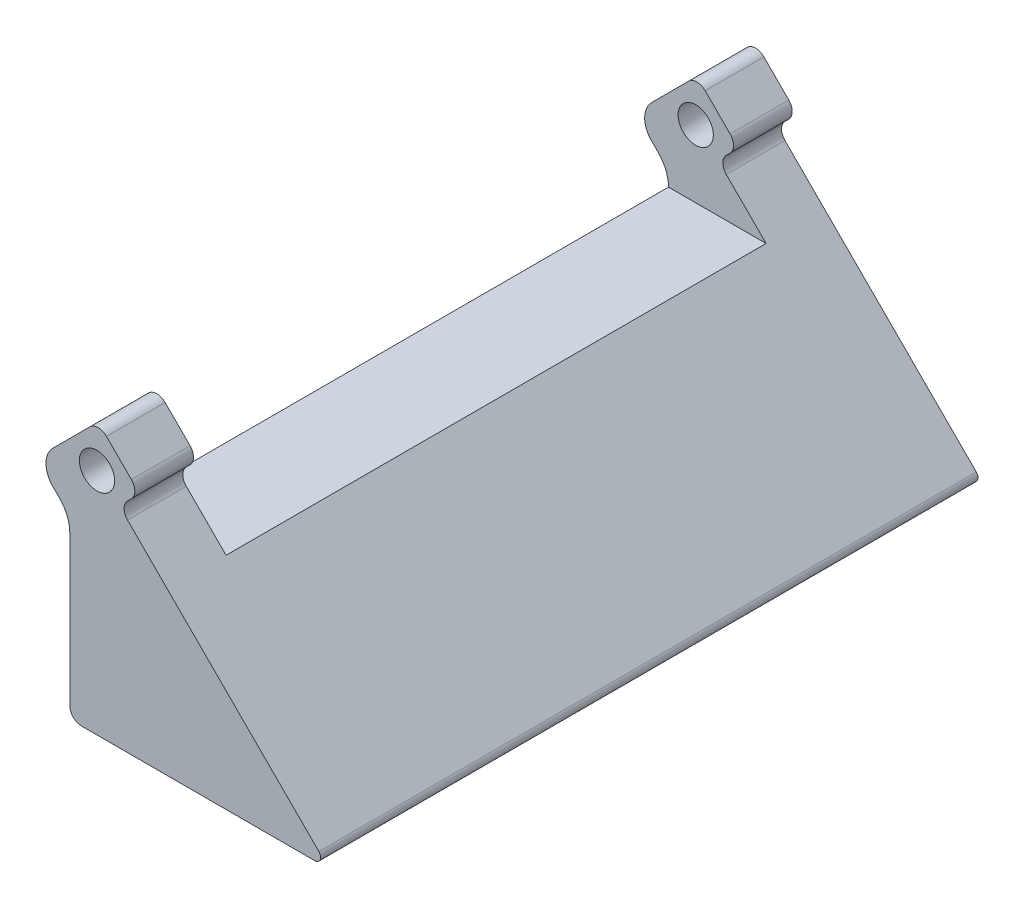
ISO-10303-21;
HEADER;
FILE_DESCRIPTION(('STEP AP214'),'2;1');
FILE_NAME('part.step','',(''),(''),'','','');
FILE_SCHEMA(('AUTOMOTIVE_DESIGN { 1 0 10303 214 1 1 1 1 }'));
ENDSEC;
DATA;
#1=APPLICATION_CONTEXT('core data for automotive mechanical design processes');
#2=APPLICATION_PROTOCOL_DEFINITION('international standard','automotive_design',2000,#1);
#3=PRODUCT_CONTEXT('',#1,'mechanical');
#4=PRODUCT('Part','Part','',(#3));
#5=PRODUCT_RELATED_PRODUCT_CATEGORY('part','',(#4));
#6=PRODUCT_DEFINITION_FORMATION('','',#4);
#7=PRODUCT_DEFINITION_CONTEXT('part definition',#1,'design');
#8=PRODUCT_DEFINITION('design','',#6,#7);
#9=PRODUCT_DEFINITION_SHAPE('','',#8);
#10=(LENGTH_UNIT() NAMED_UNIT(*) SI_UNIT(.MILLI.,.METRE.));
#11=(NAMED_UNIT(*) PLANE_ANGLE_UNIT() SI_UNIT($,.RADIAN.));
#12=(NAMED_UNIT(*) SI_UNIT($,.STERADIAN.) SOLID_ANGLE_UNIT());
#13=UNCERTAINTY_MEASURE_WITH_UNIT(LENGTH_MEASURE(1.E-05),#10,'distance_accuracy_value','');
#14=(GEOMETRIC_REPRESENTATION_CONTEXT(3) GLOBAL_UNCERTAINTY_ASSIGNED_CONTEXT((#13)) GLOBAL_UNIT_ASSIGNED_CONTEXT((#10,
#11,#12)) REPRESENTATION_CONTEXT('',''));
#15=CARTESIAN_POINT('',(0.,0.,0.));
#16=DIRECTION('',(0.,0.,1.));
#17=DIRECTION('',(1.,0.,0.));
#18=AXIS2_PLACEMENT_3D('',#15,#16,#17);
#19=CARTESIAN_POINT('',(0.,0.,5.));
#20=DIRECTION('',(0.,0.,1.));
#21=DIRECTION('',(1.,0.,0.));
#22=AXIS2_PLACEMENT_3D('',#19,#20,#21);
#23=PLANE('',#22);
#24=CARTESIAN_POINT('',(0.,0.,5.));
#25=DIRECTION('',(0.,0.,1.));
#26=DIRECTION('',(1.,0.,0.));
#27=AXIS2_PLACEMENT_3D('',#24,#25,#26);
#28=CIRCLE('',#27,1.5);
#29=CARTESIAN_POINT('',(1.5,0.,5.));
#30=VERTEX_POINT('',#29);
#31=EDGE_CURVE('E200',#30,#30,#28,.T.);
#32=ORIENTED_EDGE('',*,*,#31,.F.);
#33=EDGE_LOOP('',(#32));
#34=FACE_BOUND('',#33,.T.);
#35=CARTESIAN_POINT('',(-5.31779759019789,-5.74264068711928,5.));
#36=DIRECTION('',(0.,0.,1.));
#37=DIRECTION('',(1.,0.,0.));
#38=AXIS2_PLACEMENT_3D('',#35,#36,#37);
#39=CIRCLE('',#38,3.);
#40=CARTESIAN_POINT('',(-3.19647724663825,-3.62132034355965,5.));
#41=VERTEX_POINT('',#40);
#42=CARTESIAN_POINT('',(-2.31779759019789,-5.74264068711928,5.));
#43=VERTEX_POINT('',#42);
#44=EDGE_CURVE('E120',#41,#43,#39,.F.);
#45=ORIENTED_EDGE('',*,*,#44,.T.);
#46=DIRECTION('',(1.,0.,0.));
#47=VECTOR('',#46,1.);
#48=CARTESIAN_POINT('',(0.,-5.74264068711928,5.));
#49=LINE('',#48,#47);
#50=CARTESIAN_POINT('',(5.99591090878685,-5.74264068711928,5.));
#51=VERTEX_POINT('',#50);
#52=EDGE_CURVE('E327',#43,#51,#49,.T.);
#53=ORIENTED_EDGE('',*,*,#52,.T.);
#54=DIRECTION('',(0.707106781186546,-0.707106781186549,0.));
#55=VECTOR('',#54,1.);
#56=CARTESIAN_POINT('',(0.126635110833791,0.126635110833791,5.));
#57=LINE('',#56,#55);
#58=CARTESIAN_POINT('',(2.6015088449867,-2.34823862331913,5.));
#59=VERTEX_POINT('',#58);
#60=EDGE_CURVE('E336',#59,#51,#57,.T.);
#61=ORIENTED_EDGE('',*,*,#60,.F.);
#62=CARTESIAN_POINT('',(3.3086156261732,-1.64113184213263,5.));
#63=DIRECTION('',(0.,0.,1.));
#64=DIRECTION('',(1.,0.,0.));
#65=AXIS2_PLACEMENT_3D('',#62,#63,#64);
#66=CIRCLE('',#65,0.999999999999965);
#67=CARTESIAN_POINT('',(2.60150884498671,-0.934025060946035,5.));
#68=VERTEX_POINT('',#67);
#69=EDGE_CURVE('E339',#68,#59,#66,.T.);
#70=ORIENTED_EDGE('',*,*,#69,.F.);
#71=DIRECTION('',(0.707106781186548,0.707106781186547,0.));
#72=VECTOR('',#71,1.);
#73=CARTESIAN_POINT('',(1.76776695296637,-1.76776695296637,5.));
#74=LINE('',#73,#72);
#75=CARTESIAN_POINT('',(2.92742207411231,-0.608111831820435,5.));
#76=VERTEX_POINT('',#75);
#77=EDGE_CURVE('E342',#68,#76,#74,.T.);
#78=ORIENTED_EDGE('',*,*,#77,.T.);
#79=CARTESIAN_POINT('',(2.22031529292576,0.0989949493661127,5.));
#80=DIRECTION('',(0.,0.,1.));
#81=DIRECTION('',(1.,0.,0.));
#82=AXIS2_PLACEMENT_3D('',#79,#80,#81);
#83=CIRCLE('',#82,0.999999999999999);
#84=CARTESIAN_POINT('',(2.92742207411231,0.80610173055266,5.));
#85=VERTEX_POINT('',#84);
#86=EDGE_CURVE('E344',#76,#85,#83,.T.);
#87=ORIENTED_EDGE('',*,*,#86,.T.);
#88=DIRECTION('',(-0.707106781186547,0.707106781186548,0.));
#89=VECTOR('',#88,1.);
#90=CARTESIAN_POINT('',(1.86676190233249,1.86676190233248,5.));
#91=LINE('',#90,#89);
#92=CARTESIAN_POINT('',(0.806101730552668,2.92742207411231,5.));
#93=VERTEX_POINT('',#92);
#94=EDGE_CURVE('E145',#85,#93,#91,.T.);
#95=ORIENTED_EDGE('',*,*,#94,.T.);
#96=CARTESIAN_POINT('',(0.0989949493661204,2.22031529292576,5.));
#97=DIRECTION('',(0.,0.,1.));
#98=DIRECTION('',(1.,0.,0.));
#99=AXIS2_PLACEMENT_3D('',#96,#97,#98);
#100=CIRCLE('',#99,1.);
#101=CARTESIAN_POINT('',(-0.608111831820426,2.92742207411231,5.));
#102=VERTEX_POINT('',#101);
#103=EDGE_CURVE('E139',#93,#102,#100,.T.);
#104=ORIENTED_EDGE('',*,*,#103,.T.);
#105=DIRECTION('',(-0.707106781186549,-0.707106781186546,0.));
#106=VECTOR('',#105,1.);
#107=CARTESIAN_POINT('',(-1.76776695296637,1.76776695296637,5.));
#108=LINE('',#107,#106);
#109=CARTESIAN_POINT('',(-3.76245218569227,-0.226918279759524,5.));
#110=VERTEX_POINT('',#109);
#111=EDGE_CURVE('E142',#102,#110,#108,.T.);
#112=ORIENTED_EDGE('',*,*,#111,.T.);
#113=CARTESIAN_POINT('',(-2.34823862331918,-1.64113184213262,5.));
#114=DIRECTION('',(0.,0.,1.));
#115=DIRECTION('',(1.,0.,0.));
#116=AXIS2_PLACEMENT_3D('',#113,#114,#115);
#117=CIRCLE('',#116,2.);
#118=CARTESIAN_POINT('',(-3.76245218569227,-3.05534540450572,5.));
#119=VERTEX_POINT('',#118);
#120=EDGE_CURVE('E61',#110,#119,#117,.T.);
#121=ORIENTED_EDGE('',*,*,#120,.T.);
#122=DIRECTION('',(0.707106781186606,-0.70710678118649,0.));
#123=VECTOR('',#122,1.);
#124=CARTESIAN_POINT('',(-3.40889879509868,-3.40889879509924,5.));
#125=LINE('',#124,#123);
#126=EDGE_CURVE('E333',#119,#41,#125,.T.);
#127=ORIENTED_EDGE('',*,*,#126,.T.);
#128=EDGE_LOOP('',(#45,#53,#61,#70,#78,#87,#95,#104,#112,#121,#127));
#129=FACE_BOUND('',#128,.T.);
#130=ADVANCED_FACE('F37',(#34,#129),#23,.T.);
#131=CARTESIAN_POINT('',(-3.40889879509868,-3.40889879509924,5.));
#132=DIRECTION('',(0.70710678118649,0.707106781186606,0.));
#133=DIRECTION('',(-0.707106781186606,0.70710678118649,0.));
#134=AXIS2_PLACEMENT_3D('',#131,#132,#133);
#135=PLANE('',#134);
#136=DIRECTION('',(0.707106781186606,-0.70710678118649,0.));
#137=VECTOR('',#136,1.);
#138=CARTESIAN_POINT('',(-3.40889879509868,-3.40889879509924,0.));
#139=LINE('',#138,#137);
#140=CARTESIAN_POINT('',(-3.76245218569227,-3.05534540450572,0.));
#141=VERTEX_POINT('',#140);
#142=CARTESIAN_POINT('',(-3.19647724663825,-3.62132034355965,0.));
#143=VERTEX_POINT('',#142);
#144=EDGE_CURVE('E169',#141,#143,#139,.T.);
#145=ORIENTED_EDGE('',*,*,#144,.T.);
#146=DIRECTION('',(0.,0.,-1.));
#147=VECTOR('',#146,1.);
#148=CARTESIAN_POINT('',(-3.19647724663825,-3.62132034355965,5.));
#149=LINE('',#148,#147);
#150=EDGE_CURVE('E11',#41,#143,#149,.T.);
#151=ORIENTED_EDGE('',*,*,#150,.F.);
#152=ORIENTED_EDGE('',*,*,#126,.F.);
#153=DIRECTION('',(0.,0.,-1.));
#154=VECTOR('',#153,1.);
#155=CARTESIAN_POINT('',(-3.76245218569227,-3.05534540450572,5.));
#156=LINE('',#155,#154);
#157=EDGE_CURVE('E162',#119,#141,#156,.T.);
#158=ORIENTED_EDGE('',*,*,#157,.T.);
#159=EDGE_LOOP('',(#145,#151,#152,#158));
#160=FACE_BOUND('',#159,.T.);
#161=ADVANCED_FACE('F360',(#160),#135,.F.);
#162=CARTESIAN_POINT('',(-5.31779759019789,-5.74264068711928,5.));
#163=DIRECTION('',(0.,0.,-1.));
#164=DIRECTION('',(-1.,0.,0.));
#165=AXIS2_PLACEMENT_3D('',#162,#163,#164);
#166=CYLINDRICAL_SURFACE('',#165,3.);
#167=CARTESIAN_POINT('',(-5.31779759019789,-5.74264068711928,0.));
#168=DIRECTION('',(0.,0.,1.));
#169=DIRECTION('',(1.,0.,0.));
#170=AXIS2_PLACEMENT_3D('',#167,#168,#169);
#171=CIRCLE('',#170,3.);
#172=CARTESIAN_POINT('',(-2.31779759019789,-5.74264068711928,0.));
#173=VERTEX_POINT('',#172);
#174=EDGE_CURVE('E173',#143,#173,#171,.F.);
#175=ORIENTED_EDGE('',*,*,#174,.T.);
#176=DIRECTION('',(0.,0.,-1.));
#177=VECTOR('',#176,1.);
#178=CARTESIAN_POINT('',(-2.31779759019789,-5.74264068711928,5.));
#179=LINE('',#178,#177);
#180=EDGE_CURVE('E45',#43,#173,#179,.T.);
#181=ORIENTED_EDGE('',*,*,#180,.F.);
#182=ORIENTED_EDGE('',*,*,#44,.F.);
#183=ORIENTED_EDGE('',*,*,#150,.T.);
#184=EDGE_LOOP('',(#175,#181,#182,#183));
#185=FACE_BOUND('',#184,.T.);
#186=ADVANCED_FACE('F518',(#185),#166,.F.);
#187=CARTESIAN_POINT('',(-2.31779759019789,0.,5.));
#188=DIRECTION('',(1.,0.,0.));
#189=DIRECTION('',(0.,1.,0.));
#190=AXIS2_PLACEMENT_3D('',#187,#188,#189);
#191=PLANE('',#190);
#192=DIRECTION('',(0.,-1.,0.));
#193=VECTOR('',#192,1.);
#194=CARTESIAN_POINT('',(-2.31779759019789,0.,0.));
#195=LINE('',#194,#193);
#196=CARTESIAN_POINT('',(-2.31779759019789,-18.5,0.));
#197=VERTEX_POINT('',#196);
#198=EDGE_CURVE('E175',#173,#197,#195,.T.);
#199=ORIENTED_EDGE('',*,*,#198,.T.);
#200=DIRECTION('',(0.,0.,-1.));
#201=VECTOR('',#200,1.);
#202=CARTESIAN_POINT('',(-2.31779759019789,-18.5,5.));
#203=LINE('',#202,#201);
#204=CARTESIAN_POINT('',(-2.31779759019789,-18.5,56.));
#205=VERTEX_POINT('',#204);
#206=EDGE_CURVE('E222',#205,#197,#203,.T.);
#207=ORIENTED_EDGE('',*,*,#206,.F.);
#208=DIRECTION('',(0.,-1.,0.));
#209=VECTOR('',#208,1.);
#210=CARTESIAN_POINT('',(-2.31779759019789,0.,56.));
#211=LINE('',#210,#209);
#212=CARTESIAN_POINT('',(-2.31779759019789,-5.74264068711928,56.));
#213=VERTEX_POINT('',#212);
#214=EDGE_CURVE('E264',#213,#205,#211,.T.);
#215=ORIENTED_EDGE('',*,*,#214,.F.);
#216=DIRECTION('',(0.,0.,1.));
#217=VECTOR('',#216,1.);
#218=CARTESIAN_POINT('',(-2.31779759019789,-5.74264068711928,51.));
#219=LINE('',#218,#217);
#220=CARTESIAN_POINT('',(-2.31779759019789,-5.74264068711928,51.));
#221=VERTEX_POINT('',#220);
#222=EDGE_CURVE('E321',#221,#213,#219,.T.);
#223=ORIENTED_EDGE('',*,*,#222,.F.);
#224=DIRECTION('',(0.,0.,-1.));
#225=VECTOR('',#224,1.);
#226=CARTESIAN_POINT('',(-2.31779759019789,-5.74264068711928,28.));
#227=LINE('',#226,#225);
#228=EDGE_CURVE('E170',#221,#43,#227,.T.);
#229=ORIENTED_EDGE('',*,*,#228,.T.);
#230=ORIENTED_EDGE('',*,*,#180,.T.);
#231=EDGE_LOOP('',(#199,#207,#215,#223,#229,#230));
#232=FACE_BOUND('',#231,.T.);
#233=ADVANCED_FACE('F228',(#232),#191,.F.);
#234=CARTESIAN_POINT('',(-1.31779759019789,-18.5,5.));
#235=DIRECTION('',(0.,0.,-1.));
#236=DIRECTION('',(-1.,0.,0.));
#237=AXIS2_PLACEMENT_3D('',#234,#235,#236);
#238=CYLINDRICAL_SURFACE('',#237,1.);
#239=CARTESIAN_POINT('',(-1.31779759019789,-18.5,0.));
#240=DIRECTION('',(0.,0.,1.));
#241=DIRECTION('',(1.,0.,0.));
#242=AXIS2_PLACEMENT_3D('',#239,#240,#241);
#243=CIRCLE('',#242,1.);
#244=CARTESIAN_POINT('',(-1.31779759019789,-19.5,0.));
#245=VERTEX_POINT('',#244);
#246=EDGE_CURVE('E177',#197,#245,#243,.T.);
#247=ORIENTED_EDGE('',*,*,#246,.T.);
#248=DIRECTION('',(0.,0.,-1.));
#249=VECTOR('',#248,1.);
#250=CARTESIAN_POINT('',(-1.31779759019789,-19.5,5.));
#251=LINE('',#250,#249);
#252=CARTESIAN_POINT('',(-1.31779759019789,-19.5,56.));
#253=VERTEX_POINT('',#252);
#254=EDGE_CURVE('E219',#253,#245,#251,.T.);
#255=ORIENTED_EDGE('',*,*,#254,.F.);
#256=CARTESIAN_POINT('',(-1.31779759019789,-18.5,56.));
#257=DIRECTION('',(0.,0.,1.));
#258=DIRECTION('',(1.,0.,0.));
#259=AXIS2_PLACEMENT_3D('',#256,#257,#258);
#260=CIRCLE('',#259,1.);
#261=EDGE_CURVE('E257',#205,#253,#260,.T.);
#262=ORIENTED_EDGE('',*,*,#261,.F.);
#263=ORIENTED_EDGE('',*,*,#206,.T.);
#264=EDGE_LOOP('',(#247,#255,#262,#263));
#265=FACE_BOUND('',#264,.T.);
#266=ADVANCED_FACE('F240',(#265),#238,.T.);
#267=CARTESIAN_POINT('',(0.,-19.5,5.));
#268=DIRECTION('',(0.,1.,0.));
#269=DIRECTION('',(-1.,0.,0.));
#270=AXIS2_PLACEMENT_3D('',#267,#268,#269);
#271=PLANE('',#270);
#272=DIRECTION('',(1.,0.,0.));
#273=VECTOR('',#272,1.);
#274=CARTESIAN_POINT('',(0.,-19.5,0.));
#275=LINE('',#274,#273);
#276=CARTESIAN_POINT('',(18.546163440481,-19.5,0.));
#277=VERTEX_POINT('',#276);
#278=EDGE_CURVE('E179',#245,#277,#275,.T.);
#279=ORIENTED_EDGE('',*,*,#278,.T.);
#280=DIRECTION('',(0.,0.,-1.));
#281=VECTOR('',#280,1.);
#282=CARTESIAN_POINT('',(18.546163440481,-19.5,5.));
#283=LINE('',#282,#281);
#284=CARTESIAN_POINT('',(18.546163440481,-19.5,56.));
#285=VERTEX_POINT('',#284);
#286=EDGE_CURVE('E216',#285,#277,#283,.T.);
#287=ORIENTED_EDGE('',*,*,#286,.F.);
#288=DIRECTION('',(1.,0.,0.));
#289=VECTOR('',#288,1.);
#290=CARTESIAN_POINT('',(0.,-19.5,56.));
#291=LINE('',#290,#289);
#292=EDGE_CURVE('E248',#253,#285,#291,.T.);
#293=ORIENTED_EDGE('',*,*,#292,.F.);
#294=ORIENTED_EDGE('',*,*,#254,.T.);
#295=EDGE_LOOP('',(#279,#287,#293,#294));
#296=FACE_BOUND('',#295,.T.);
#297=ADVANCED_FACE('F245',(#296),#271,.F.);
#298=CARTESIAN_POINT('',(18.5461634404809,-19.,5.));
#299=DIRECTION('',(0.,0.,-1.));
#300=DIRECTION('',(-1.,0.,0.));
#301=AXIS2_PLACEMENT_3D('',#298,#299,#300);
#302=CYLINDRICAL_SURFACE('',#301,0.500000000000035);
#303=CARTESIAN_POINT('',(18.5461634404809,-19.,0.));
#304=DIRECTION('',(0.,0.,1.));
#305=DIRECTION('',(1.,0.,0.));
#306=AXIS2_PLACEMENT_3D('',#303,#304,#305);
#307=CIRCLE('',#306,0.500000000000035);
#308=CARTESIAN_POINT('',(18.8997168310743,-18.6464466094067,0.));
#309=VERTEX_POINT('',#308);
#310=EDGE_CURVE('E181',#277,#309,#307,.T.);
#311=ORIENTED_EDGE('',*,*,#310,.T.);
#312=DIRECTION('',(0.,0.,-1.));
#313=VECTOR('',#312,1.);
#314=CARTESIAN_POINT('',(18.8997168310743,-18.6464466094067,5.));
#315=LINE('',#314,#313);
#316=CARTESIAN_POINT('',(18.8997168310743,-18.6464466094067,56.));
#317=VERTEX_POINT('',#316);
#318=EDGE_CURVE('E214',#317,#309,#315,.T.);
#319=ORIENTED_EDGE('',*,*,#318,.F.);
#320=CARTESIAN_POINT('',(18.5461634404809,-19.,56.));
#321=DIRECTION('',(0.,0.,1.));
#322=DIRECTION('',(1.,0.,0.));
#323=AXIS2_PLACEMENT_3D('',#320,#321,#322);
#324=CIRCLE('',#323,0.500000000000035);
#325=EDGE_CURVE('E256',#285,#317,#324,.T.);
#326=ORIENTED_EDGE('',*,*,#325,.F.);
#327=ORIENTED_EDGE('',*,*,#286,.T.);
#328=EDGE_LOOP('',(#311,#319,#326,#327));
#329=FACE_BOUND('',#328,.T.);
#330=ADVANCED_FACE('F501',(#329),#302,.T.);
#331=CARTESIAN_POINT('',(0.126635110833791,0.126635110833791,5.));
#332=DIRECTION('',(0.707106781186549,0.707106781186546,0.));
#333=DIRECTION('',(-0.707106781186546,0.707106781186549,0.));
#334=AXIS2_PLACEMENT_3D('',#331,#332,#333);
#335=PLANE('',#334);
#336=DIRECTION('',(0.707106781186546,-0.707106781186549,0.));
#337=VECTOR('',#336,1.);
#338=CARTESIAN_POINT('',(0.126635110833791,0.126635110833791,0.));
#339=LINE('',#338,#337);
#340=CARTESIAN_POINT('',(2.6015088449867,-2.34823862331913,0.));
#341=VERTEX_POINT('',#340);
#342=EDGE_CURVE('E184',#341,#309,#339,.T.);
#343=ORIENTED_EDGE('',*,*,#342,.F.);
#344=DIRECTION('',(0.,0.,-1.));
#345=VECTOR('',#344,1.);
#346=CARTESIAN_POINT('',(2.6015088449867,-2.34823862331913,5.));
#347=LINE('',#346,#345);
#348=EDGE_CURVE('E212',#59,#341,#347,.T.);
#349=ORIENTED_EDGE('',*,*,#348,.F.);
#350=ORIENTED_EDGE('',*,*,#60,.T.);
#351=DIRECTION('',(0.,0.,-1.));
#352=VECTOR('',#351,1.);
#353=CARTESIAN_POINT('',(5.99591090878685,-5.74264068711928,28.));
#354=LINE('',#353,#352);
#355=CARTESIAN_POINT('',(5.99591090878685,-5.74264068711928,51.));
#356=VERTEX_POINT('',#355);
#357=EDGE_CURVE('E52',#356,#51,#354,.T.);
#358=ORIENTED_EDGE('',*,*,#357,.F.);
#359=DIRECTION('',(0.707106781186546,-0.707106781186549,0.));
#360=VECTOR('',#359,1.);
#361=CARTESIAN_POINT('',(0.126635110833791,0.126635110833791,51.));
#362=LINE('',#361,#360);
#363=CARTESIAN_POINT('',(2.6015088449867,-2.34823862331913,51.));
#364=VERTEX_POINT('',#363);
#365=EDGE_CURVE('E438',#364,#356,#362,.T.);
#366=ORIENTED_EDGE('',*,*,#365,.F.);
#367=DIRECTION('',(0.,0.,1.));
#368=VECTOR('',#367,1.);
#369=CARTESIAN_POINT('',(2.6015088449867,-2.34823862331913,51.));
#370=LINE('',#369,#368);
#371=CARTESIAN_POINT('',(2.6015088449867,-2.34823862331913,56.));
#372=VERTEX_POINT('',#371);
#373=EDGE_CURVE('E318',#364,#372,#370,.T.);
#374=ORIENTED_EDGE('',*,*,#373,.T.);
#375=DIRECTION('',(0.707106781186546,-0.707106781186549,0.));
#376=VECTOR('',#375,1.);
#377=CARTESIAN_POINT('',(0.126635110833791,0.126635110833791,56.));
#378=LINE('',#377,#376);
#379=EDGE_CURVE('E271',#372,#317,#378,.T.);
#380=ORIENTED_EDGE('',*,*,#379,.T.);
#381=ORIENTED_EDGE('',*,*,#318,.T.);
#382=EDGE_LOOP('',(#343,#349,#350,#358,#366,#374,#380,#381));
#383=FACE_BOUND('',#382,.T.);
#384=ADVANCED_FACE('F498',(#383),#335,.T.);
#385=CARTESIAN_POINT('',(3.3086156261732,-1.64113184213263,5.));
#386=DIRECTION('',(0.,0.,-1.));
#387=DIRECTION('',(-1.,0.,0.));
#388=AXIS2_PLACEMENT_3D('',#385,#386,#387);
#389=CYLINDRICAL_SURFACE('',#388,0.999999999999965);
#390=CARTESIAN_POINT('',(3.3086156261732,-1.64113184213263,0.));
#391=DIRECTION('',(0.,0.,1.));
#392=DIRECTION('',(1.,0.,0.));
#393=AXIS2_PLACEMENT_3D('',#390,#391,#392);
#394=CIRCLE('',#393,0.999999999999965);
#395=CARTESIAN_POINT('',(2.60150884498671,-0.934025060946035,0.));
#396=VERTEX_POINT('',#395);
#397=EDGE_CURVE('E187',#396,#341,#394,.T.);
#398=ORIENTED_EDGE('',*,*,#397,.F.);
#399=DIRECTION('',(0.,0.,-1.));
#400=VECTOR('',#399,1.);
#401=CARTESIAN_POINT('',(2.60150884498671,-0.934025060946035,5.));
#402=LINE('',#401,#400);
#403=EDGE_CURVE('E210',#68,#396,#402,.T.);
#404=ORIENTED_EDGE('',*,*,#403,.F.);
#405=ORIENTED_EDGE('',*,*,#69,.T.);
#406=ORIENTED_EDGE('',*,*,#348,.T.);
#407=EDGE_LOOP('',(#398,#404,#405,#406));
#408=FACE_BOUND('',#407,.T.);
#409=ADVANCED_FACE('F500',(#408),#389,.F.);
#410=CARTESIAN_POINT('',(1.76776695296637,-1.76776695296637,5.));
#411=DIRECTION('',(-0.707106781186547,0.707106781186548,0.));
#412=DIRECTION('',(-0.707106781186548,-0.707106781186547,0.));
#413=AXIS2_PLACEMENT_3D('',#410,#411,#412);
#414=PLANE('',#413);
#415=DIRECTION('',(0.707106781186548,0.707106781186547,0.));
#416=VECTOR('',#415,1.);
#417=CARTESIAN_POINT('',(1.76776695296637,-1.76776695296637,0.));
#418=LINE('',#417,#416);
#419=CARTESIAN_POINT('',(2.92742207411231,-0.608111831820435,0.));
#420=VERTEX_POINT('',#419);
#421=EDGE_CURVE('E190',#396,#420,#418,.T.);
#422=ORIENTED_EDGE('',*,*,#421,.T.);
#423=DIRECTION('',(0.,0.,-1.));
#424=VECTOR('',#423,1.);
#425=CARTESIAN_POINT('',(2.92742207411231,-0.608111831820435,5.));
#426=LINE('',#425,#424);
#427=EDGE_CURVE('E207',#76,#420,#426,.T.);
#428=ORIENTED_EDGE('',*,*,#427,.F.);
#429=ORIENTED_EDGE('',*,*,#77,.F.);
#430=ORIENTED_EDGE('',*,*,#403,.T.);
#431=EDGE_LOOP('',(#422,#428,#429,#430));
#432=FACE_BOUND('',#431,.T.);
#433=ADVANCED_FACE('F507',(#432),#414,.F.);
#434=CARTESIAN_POINT('',(2.22031529292576,0.0989949493661127,5.));
#435=DIRECTION('',(0.,0.,-1.));
#436=DIRECTION('',(-1.,0.,0.));
#437=AXIS2_PLACEMENT_3D('',#434,#435,#436);
#438=CYLINDRICAL_SURFACE('',#437,0.999999999999999);
#439=CARTESIAN_POINT('',(2.22031529292576,0.0989949493661127,0.));
#440=DIRECTION('',(0.,0.,1.));
#441=DIRECTION('',(1.,0.,0.));
#442=AXIS2_PLACEMENT_3D('',#439,#440,#441);
#443=CIRCLE('',#442,0.999999999999999);
#444=CARTESIAN_POINT('',(2.92742207411231,0.80610173055266,0.));
#445=VERTEX_POINT('',#444);
#446=EDGE_CURVE('E192',#420,#445,#443,.T.);
#447=ORIENTED_EDGE('',*,*,#446,.T.);
#448=DIRECTION('',(0.,0.,-1.));
#449=VECTOR('',#448,1.);
#450=CARTESIAN_POINT('',(2.92742207411231,0.80610173055266,5.));
#451=LINE('',#450,#449);
#452=EDGE_CURVE('E204',#85,#445,#451,.T.);
#453=ORIENTED_EDGE('',*,*,#452,.F.);
#454=ORIENTED_EDGE('',*,*,#86,.F.);
#455=ORIENTED_EDGE('',*,*,#427,.T.);
#456=EDGE_LOOP('',(#447,#453,#454,#455));
#457=FACE_BOUND('',#456,.T.);
#458=ADVANCED_FACE('F351',(#457),#438,.T.);
#459=CARTESIAN_POINT('',(1.86676190233249,1.86676190233248,5.));
#460=DIRECTION('',(-0.707106781186548,-0.707106781186547,0.));
#461=DIRECTION('',(0.707106781186547,-0.707106781186548,0.));
#462=AXIS2_PLACEMENT_3D('',#459,#460,#461);
#463=PLANE('',#462);
#464=DIRECTION('',(-0.707106781186547,0.707106781186548,0.));
#465=VECTOR('',#464,1.);
#466=CARTESIAN_POINT('',(1.86676190233249,1.86676190233248,0.));
#467=LINE('',#466,#465);
#468=CARTESIAN_POINT('',(0.806101730552668,2.92742207411231,0.));
#469=VERTEX_POINT('',#468);
#470=EDGE_CURVE('E194',#445,#469,#467,.T.);
#471=ORIENTED_EDGE('',*,*,#470,.T.);
#472=DIRECTION('',(0.,0.,-1.));
#473=VECTOR('',#472,1.);
#474=CARTESIAN_POINT('',(0.806101730552668,2.92742207411231,5.));
#475=LINE('',#474,#473);
#476=EDGE_CURVE('E157',#93,#469,#475,.T.);
#477=ORIENTED_EDGE('',*,*,#476,.F.);
#478=ORIENTED_EDGE('',*,*,#94,.F.);
#479=ORIENTED_EDGE('',*,*,#452,.T.);
#480=EDGE_LOOP('',(#471,#477,#478,#479));
#481=FACE_BOUND('',#480,.T.);
#482=ADVANCED_FACE('F355',(#481),#463,.F.);
#483=CARTESIAN_POINT('',(0.0989949493661204,2.22031529292576,5.));
#484=DIRECTION('',(0.,0.,-1.));
#485=DIRECTION('',(-1.,0.,0.));
#486=AXIS2_PLACEMENT_3D('',#483,#484,#485);
#487=CYLINDRICAL_SURFACE('',#486,1.);
#488=CARTESIAN_POINT('',(0.0989949493661204,2.22031529292576,0.));
#489=DIRECTION('',(0.,0.,1.));
#490=DIRECTION('',(1.,0.,0.));
#491=AXIS2_PLACEMENT_3D('',#488,#489,#490);
#492=CIRCLE('',#491,1.);
#493=CARTESIAN_POINT('',(-0.608111831820426,2.92742207411231,0.));
#494=VERTEX_POINT('',#493);
#495=EDGE_CURVE('E154',#469,#494,#492,.T.);
#496=ORIENTED_EDGE('',*,*,#495,.T.);
#497=DIRECTION('',(0.,0.,-1.));
#498=VECTOR('',#497,1.);
#499=CARTESIAN_POINT('',(-0.608111831820426,2.92742207411231,5.));
#500=LINE('',#499,#498);
#501=EDGE_CURVE('E151',#102,#494,#500,.T.);
#502=ORIENTED_EDGE('',*,*,#501,.F.);
#503=ORIENTED_EDGE('',*,*,#103,.F.);
#504=ORIENTED_EDGE('',*,*,#476,.T.);
#505=EDGE_LOOP('',(#496,#502,#503,#504));
#506=FACE_BOUND('',#505,.T.);
#507=ADVANCED_FACE('F152',(#506),#487,.T.);
#508=CARTESIAN_POINT('',(-1.76776695296637,1.76776695296637,5.));
#509=DIRECTION('',(0.707106781186546,-0.707106781186549,0.));
#510=DIRECTION('',(0.707106781186549,0.707106781186546,0.));
#511=AXIS2_PLACEMENT_3D('',#508,#509,#510);
#512=PLANE('',#511);
#513=DIRECTION('',(-0.707106781186549,-0.707106781186546,0.));
#514=VECTOR('',#513,1.);
#515=CARTESIAN_POINT('',(-1.76776695296637,1.76776695296637,0.));
#516=LINE('',#515,#514);
#517=CARTESIAN_POINT('',(-3.76245218569227,-0.226918279759524,0.));
#518=VERTEX_POINT('',#517);
#519=EDGE_CURVE('E197',#494,#518,#516,.T.);
#520=ORIENTED_EDGE('',*,*,#519,.T.);
#521=DIRECTION('',(0.,0.,-1.));
#522=VECTOR('',#521,1.);
#523=CARTESIAN_POINT('',(-3.76245218569227,-0.226918279759524,5.));
#524=LINE('',#523,#522);
#525=EDGE_CURVE('E158',#110,#518,#524,.T.);
#526=ORIENTED_EDGE('',*,*,#525,.F.);
#527=ORIENTED_EDGE('',*,*,#111,.F.);
#528=ORIENTED_EDGE('',*,*,#501,.T.);
#529=EDGE_LOOP('',(#520,#526,#527,#528));
#530=FACE_BOUND('',#529,.T.);
#531=ADVANCED_FACE('F160',(#530),#512,.F.);
#532=CARTESIAN_POINT('',(0.,0.,5.));
#533=DIRECTION('',(0.,0.,-1.));
#534=DIRECTION('',(-1.,0.,0.));
#535=AXIS2_PLACEMENT_3D('',#532,#533,#534);
#536=CYLINDRICAL_SURFACE('',#535,1.5);
#537=ORIENTED_EDGE('',*,*,#31,.T.);
#538=EDGE_LOOP('',(#537));
#539=FACE_BOUND('',#538,.T.);
#540=CARTESIAN_POINT('',(0.,0.,0.));
#541=DIRECTION('',(0.,0.,1.));
#542=DIRECTION('',(1.,0.,0.));
#543=AXIS2_PLACEMENT_3D('',#540,#541,#542);
#544=CIRCLE('',#543,1.5);
#545=CARTESIAN_POINT('',(1.5,0.,0.));
#546=VERTEX_POINT('',#545);
#547=EDGE_CURVE('E166',#546,#546,#544,.T.);
#548=ORIENTED_EDGE('',*,*,#547,.F.);
#549=EDGE_LOOP('',(#548));
#550=FACE_BOUND('',#549,.T.);
#551=ADVANCED_FACE('F39',(#539,#550),#536,.F.);
#552=CARTESIAN_POINT('',(-2.34823862331918,-1.64113184213262,5.));
#553=DIRECTION('',(0.,0.,-1.));
#554=DIRECTION('',(-1.,0.,0.));
#555=AXIS2_PLACEMENT_3D('',#552,#553,#554);
#556=CYLINDRICAL_SURFACE('',#555,2.);
#557=CARTESIAN_POINT('',(-2.34823862331918,-1.64113184213262,0.));
#558=DIRECTION('',(0.,0.,1.));
#559=DIRECTION('',(1.,0.,0.));
#560=AXIS2_PLACEMENT_3D('',#557,#558,#559);
#561=CIRCLE('',#560,2.);
#562=EDGE_CURVE('E112',#518,#141,#561,.T.);
#563=ORIENTED_EDGE('',*,*,#562,.T.);
#564=ORIENTED_EDGE('',*,*,#157,.F.);
#565=ORIENTED_EDGE('',*,*,#120,.F.);
#566=ORIENTED_EDGE('',*,*,#525,.T.);
#567=EDGE_LOOP('',(#563,#564,#565,#566));
#568=FACE_BOUND('',#567,.T.);
#569=ADVANCED_FACE('F356',(#568),#556,.T.);
#570=CARTESIAN_POINT('',(0.,0.,0.));
#571=DIRECTION('',(0.,0.,1.));
#572=DIRECTION('',(1.,0.,0.));
#573=AXIS2_PLACEMENT_3D('',#570,#571,#572);
#574=PLANE('',#573);
#575=ORIENTED_EDGE('',*,*,#547,.T.);
#576=EDGE_LOOP('',(#575));
#577=FACE_BOUND('',#576,.T.);
#578=ORIENTED_EDGE('',*,*,#144,.F.);
#579=ORIENTED_EDGE('',*,*,#562,.F.);
#580=ORIENTED_EDGE('',*,*,#519,.F.);
#581=ORIENTED_EDGE('',*,*,#495,.F.);
#582=ORIENTED_EDGE('',*,*,#470,.F.);
#583=ORIENTED_EDGE('',*,*,#446,.F.);
#584=ORIENTED_EDGE('',*,*,#421,.F.);
#585=ORIENTED_EDGE('',*,*,#397,.T.);
#586=ORIENTED_EDGE('',*,*,#342,.T.);
#587=ORIENTED_EDGE('',*,*,#310,.F.);
#588=ORIENTED_EDGE('',*,*,#278,.F.);
#589=ORIENTED_EDGE('',*,*,#246,.F.);
#590=ORIENTED_EDGE('',*,*,#198,.F.);
#591=ORIENTED_EDGE('',*,*,#174,.F.);
#592=EDGE_LOOP('',(#578,#579,#580,#581,#582,#583,#584,#585,#586,#587,#588,#589,#590,#591));
#593=FACE_BOUND('',#592,.T.);
#594=ADVANCED_FACE('F235',(#577,#593),#574,.F.);
#595=CARTESIAN_POINT('',(0.,-5.74264068711928,28.));
#596=DIRECTION('',(0.,1.,0.));
#597=DIRECTION('',(0.,0.,1.));
#598=AXIS2_PLACEMENT_3D('',#595,#596,#597);
#599=PLANE('',#598);
#600=ORIENTED_EDGE('',*,*,#52,.F.);
#601=ORIENTED_EDGE('',*,*,#228,.F.);
#602=DIRECTION('',(1.,0.,0.));
#603=VECTOR('',#602,1.);
#604=CARTESIAN_POINT('',(0.,-5.74264068711928,51.));
#605=LINE('',#604,#603);
#606=EDGE_CURVE('E428',#221,#356,#605,.T.);
#607=ORIENTED_EDGE('',*,*,#606,.T.);
#608=ORIENTED_EDGE('',*,*,#357,.T.);
#609=EDGE_LOOP('',(#600,#601,#607,#608));
#610=FACE_BOUND('',#609,.T.);
#611=ADVANCED_FACE('F426',(#610),#599,.T.);
#612=CARTESIAN_POINT('',(0.,0.,51.));
#613=DIRECTION('',(0.,0.,-1.));
#614=DIRECTION('',(1.,0.,0.));
#615=AXIS2_PLACEMENT_3D('',#612,#613,#614);
#616=PLANE('',#615);
#617=CARTESIAN_POINT('',(0.,0.,51.));
#618=DIRECTION('',(0.,0.,1.));
#619=DIRECTION('',(1.,0.,0.));
#620=AXIS2_PLACEMENT_3D('',#617,#618,#619);
#621=CIRCLE('',#620,1.5);
#622=CARTESIAN_POINT('',(1.5,0.,51.));
#623=VERTEX_POINT('',#622);
#624=EDGE_CURVE('E295',#623,#623,#621,.T.);
#625=ORIENTED_EDGE('',*,*,#624,.T.);
#626=EDGE_LOOP('',(#625));
#627=FACE_BOUND('',#626,.T.);
#628=CARTESIAN_POINT('',(-5.31779759019789,-5.74264068711928,51.));
#629=DIRECTION('',(0.,0.,1.));
#630=DIRECTION('',(1.,0.,0.));
#631=AXIS2_PLACEMENT_3D('',#628,#629,#630);
#632=CIRCLE('',#631,3.);
#633=CARTESIAN_POINT('',(-3.19647724663825,-3.62132034355965,51.));
#634=VERTEX_POINT('',#633);
#635=EDGE_CURVE('E436',#634,#221,#632,.F.);
#636=ORIENTED_EDGE('',*,*,#635,.F.);
#637=DIRECTION('',(0.707106781186606,-0.70710678118649,0.));
#638=VECTOR('',#637,1.);
#639=CARTESIAN_POINT('',(-3.40889879509868,-3.40889879509924,51.));
#640=LINE('',#639,#638);
#641=CARTESIAN_POINT('',(-3.76245218569227,-3.05534540450572,51.));
#642=VERTEX_POINT('',#641);
#643=EDGE_CURVE('E443',#642,#634,#640,.T.);
#644=ORIENTED_EDGE('',*,*,#643,.F.);
#645=CARTESIAN_POINT('',(-2.34823862331918,-1.64113184213262,51.));
#646=DIRECTION('',(0.,0.,1.));
#647=DIRECTION('',(1.,0.,0.));
#648=AXIS2_PLACEMENT_3D('',#645,#646,#647);
#649=CIRCLE('',#648,2.);
#650=CARTESIAN_POINT('',(-3.76245218569227,-0.226918279759524,51.));
#651=VERTEX_POINT('',#650);
#652=EDGE_CURVE('E300',#651,#642,#649,.T.);
#653=ORIENTED_EDGE('',*,*,#652,.F.);
#654=DIRECTION('',(-0.707106781186549,-0.707106781186546,0.));
#655=VECTOR('',#654,1.);
#656=CARTESIAN_POINT('',(-1.76776695296637,1.76776695296637,51.));
#657=LINE('',#656,#655);
#658=CARTESIAN_POINT('',(-0.608111831820426,2.92742207411231,51.));
#659=VERTEX_POINT('',#658);
#660=EDGE_CURVE('E463',#659,#651,#657,.T.);
#661=ORIENTED_EDGE('',*,*,#660,.F.);
#662=CARTESIAN_POINT('',(0.0989949493661204,2.22031529292576,51.));
#663=DIRECTION('',(0.,0.,1.));
#664=DIRECTION('',(1.,0.,0.));
#665=AXIS2_PLACEMENT_3D('',#662,#663,#664);
#666=CIRCLE('',#665,1.);
#667=CARTESIAN_POINT('',(0.806101730552668,2.92742207411231,51.));
#668=VERTEX_POINT('',#667);
#669=EDGE_CURVE('E460',#668,#659,#666,.T.);
#670=ORIENTED_EDGE('',*,*,#669,.F.);
#671=DIRECTION('',(-0.707106781186547,0.707106781186548,0.));
#672=VECTOR('',#671,1.);
#673=CARTESIAN_POINT('',(1.86676190233249,1.86676190233248,51.));
#674=LINE('',#673,#672);
#675=CARTESIAN_POINT('',(2.92742207411231,0.80610173055266,51.));
#676=VERTEX_POINT('',#675);
#677=EDGE_CURVE('E457',#676,#668,#674,.T.);
#678=ORIENTED_EDGE('',*,*,#677,.F.);
#679=CARTESIAN_POINT('',(2.22031529292576,0.0989949493661127,51.));
#680=DIRECTION('',(0.,0.,1.));
#681=DIRECTION('',(1.,0.,0.));
#682=AXIS2_PLACEMENT_3D('',#679,#680,#681);
#683=CIRCLE('',#682,0.999999999999999);
#684=CARTESIAN_POINT('',(2.92742207411231,-0.608111831820435,51.));
#685=VERTEX_POINT('',#684);
#686=EDGE_CURVE('E454',#685,#676,#683,.T.);
#687=ORIENTED_EDGE('',*,*,#686,.F.);
#688=DIRECTION('',(0.707106781186548,0.707106781186547,0.));
#689=VECTOR('',#688,1.);
#690=CARTESIAN_POINT('',(1.76776695296637,-1.76776695296637,51.));
#691=LINE('',#690,#689);
#692=CARTESIAN_POINT('',(2.60150884498671,-0.934025060946035,51.));
#693=VERTEX_POINT('',#692);
#694=EDGE_CURVE('E451',#693,#685,#691,.T.);
#695=ORIENTED_EDGE('',*,*,#694,.F.);
#696=CARTESIAN_POINT('',(3.3086156261732,-1.64113184213263,51.));
#697=DIRECTION('',(0.,0.,1.));
#698=DIRECTION('',(1.,0.,0.));
#699=AXIS2_PLACEMENT_3D('',#696,#697,#698);
#700=CIRCLE('',#699,0.999999999999965);
#701=EDGE_CURVE('E445',#693,#364,#700,.T.);
#702=ORIENTED_EDGE('',*,*,#701,.T.);
#703=ORIENTED_EDGE('',*,*,#365,.T.);
#704=ORIENTED_EDGE('',*,*,#606,.F.);
#705=EDGE_LOOP('',(#636,#644,#653,#661,#670,#678,#687,#695,#702,#703,#704));
#706=FACE_BOUND('',#705,.T.);
#707=ADVANCED_FACE('F434',(#627,#706),#616,.T.);
#708=CARTESIAN_POINT('',(-3.40889879509868,-3.40889879509924,51.));
#709=DIRECTION('',(0.70710678118649,0.707106781186606,0.));
#710=DIRECTION('',(-0.707106781186606,0.70710678118649,0.));
#711=AXIS2_PLACEMENT_3D('',#708,#709,#710);
#712=PLANE('',#711);
#713=DIRECTION('',(0.707106781186606,-0.70710678118649,0.));
#714=VECTOR('',#713,1.);
#715=CARTESIAN_POINT('',(-3.40889879509868,-3.40889879509924,56.));
#716=LINE('',#715,#714);
#717=CARTESIAN_POINT('',(-3.76245218569227,-3.05534540450572,56.));
#718=VERTEX_POINT('',#717);
#719=CARTESIAN_POINT('',(-3.19647724663825,-3.62132034355965,56.));
#720=VERTEX_POINT('',#719);
#721=EDGE_CURVE('E470',#718,#720,#716,.T.);
#722=ORIENTED_EDGE('',*,*,#721,.F.);
#723=DIRECTION('',(0.,0.,1.));
#724=VECTOR('',#723,1.);
#725=CARTESIAN_POINT('',(-3.76245218569227,-3.05534540450572,51.));
#726=LINE('',#725,#724);
#727=EDGE_CURVE('E296',#642,#718,#726,.T.);
#728=ORIENTED_EDGE('',*,*,#727,.F.);
#729=ORIENTED_EDGE('',*,*,#643,.T.);
#730=DIRECTION('',(0.,0.,1.));
#731=VECTOR('',#730,1.);
#732=CARTESIAN_POINT('',(-3.19647724663825,-3.62132034355965,51.));
#733=LINE('',#732,#731);
#734=EDGE_CURVE('E324',#634,#720,#733,.T.);
#735=ORIENTED_EDGE('',*,*,#734,.T.);
#736=EDGE_LOOP('',(#722,#728,#729,#735));
#737=FACE_BOUND('',#736,.T.);
#738=ADVANCED_FACE('F473',(#737),#712,.F.);
#739=CARTESIAN_POINT('',(-5.31779759019789,-5.74264068711928,51.));
#740=DIRECTION('',(0.,0.,1.));
#741=DIRECTION('',(-1.,0.,0.));
#742=AXIS2_PLACEMENT_3D('',#739,#740,#741);
#743=CYLINDRICAL_SURFACE('',#742,3.);
#744=CARTESIAN_POINT('',(-5.31779759019789,-5.74264068711928,56.));
#745=DIRECTION('',(0.,0.,1.));
#746=DIRECTION('',(1.,0.,0.));
#747=AXIS2_PLACEMENT_3D('',#744,#745,#746);
#748=CIRCLE('',#747,3.);
#749=EDGE_CURVE('E266',#720,#213,#748,.F.);
#750=ORIENTED_EDGE('',*,*,#749,.F.);
#751=ORIENTED_EDGE('',*,*,#734,.F.);
#752=ORIENTED_EDGE('',*,*,#635,.T.);
#753=ORIENTED_EDGE('',*,*,#222,.T.);
#754=EDGE_LOOP('',(#750,#751,#752,#753));
#755=FACE_BOUND('',#754,.T.);
#756=ADVANCED_FACE('F441',(#755),#743,.F.);
#757=CARTESIAN_POINT('',(3.3086156261732,-1.64113184213263,51.));
#758=DIRECTION('',(0.,0.,1.));
#759=DIRECTION('',(-1.,0.,0.));
#760=AXIS2_PLACEMENT_3D('',#757,#758,#759);
#761=CYLINDRICAL_SURFACE('',#760,0.999999999999965);
#762=CARTESIAN_POINT('',(3.3086156261732,-1.64113184213263,56.));
#763=DIRECTION('',(0.,0.,1.));
#764=DIRECTION('',(1.,0.,0.));
#765=AXIS2_PLACEMENT_3D('',#762,#763,#764);
#766=CIRCLE('',#765,0.999999999999965);
#767=CARTESIAN_POINT('',(2.60150884498671,-0.934025060946035,56.));
#768=VERTEX_POINT('',#767);
#769=EDGE_CURVE('E274',#768,#372,#766,.T.);
#770=ORIENTED_EDGE('',*,*,#769,.T.);
#771=ORIENTED_EDGE('',*,*,#373,.F.);
#772=ORIENTED_EDGE('',*,*,#701,.F.);
#773=DIRECTION('',(0.,0.,1.));
#774=VECTOR('',#773,1.);
#775=CARTESIAN_POINT('',(2.60150884498671,-0.934025060946035,51.));
#776=LINE('',#775,#774);
#777=EDGE_CURVE('E315',#693,#768,#776,.T.);
#778=ORIENTED_EDGE('',*,*,#777,.T.);
#779=EDGE_LOOP('',(#770,#771,#772,#778));
#780=FACE_BOUND('',#779,.T.);
#781=ADVANCED_FACE('F494',(#780),#761,.F.);
#782=CARTESIAN_POINT('',(1.76776695296637,-1.76776695296637,51.));
#783=DIRECTION('',(-0.707106781186547,0.707106781186548,0.));
#784=DIRECTION('',(-0.707106781186548,-0.707106781186547,0.));
#785=AXIS2_PLACEMENT_3D('',#782,#783,#784);
#786=PLANE('',#785);
#787=DIRECTION('',(0.707106781186548,0.707106781186547,0.));
#788=VECTOR('',#787,1.);
#789=CARTESIAN_POINT('',(1.76776695296637,-1.76776695296637,56.));
#790=LINE('',#789,#788);
#791=CARTESIAN_POINT('',(2.92742207411231,-0.608111831820435,56.));
#792=VERTEX_POINT('',#791);
#793=EDGE_CURVE('E277',#768,#792,#790,.T.);
#794=ORIENTED_EDGE('',*,*,#793,.F.);
#795=ORIENTED_EDGE('',*,*,#777,.F.);
#796=ORIENTED_EDGE('',*,*,#694,.T.);
#797=DIRECTION('',(0.,0.,1.));
#798=VECTOR('',#797,1.);
#799=CARTESIAN_POINT('',(2.92742207411231,-0.608111831820435,51.));
#800=LINE('',#799,#798);
#801=EDGE_CURVE('E312',#685,#792,#800,.T.);
#802=ORIENTED_EDGE('',*,*,#801,.T.);
#803=EDGE_LOOP('',(#794,#795,#796,#802));
#804=FACE_BOUND('',#803,.T.);
#805=ADVANCED_FACE('F491',(#804),#786,.F.);
#806=CARTESIAN_POINT('',(2.22031529292576,0.0989949493661127,51.));
#807=DIRECTION('',(0.,0.,1.));
#808=DIRECTION('',(-1.,0.,0.));
#809=AXIS2_PLACEMENT_3D('',#806,#807,#808);
#810=CYLINDRICAL_SURFACE('',#809,0.999999999999999);
#811=CARTESIAN_POINT('',(2.22031529292576,0.0989949493661127,56.));
#812=DIRECTION('',(0.,0.,1.));
#813=DIRECTION('',(1.,0.,0.));
#814=AXIS2_PLACEMENT_3D('',#811,#812,#813);
#815=CIRCLE('',#814,0.999999999999999);
#816=CARTESIAN_POINT('',(2.92742207411231,0.80610173055266,56.));
#817=VERTEX_POINT('',#816);
#818=EDGE_CURVE('E280',#792,#817,#815,.T.);
#819=ORIENTED_EDGE('',*,*,#818,.F.);
#820=ORIENTED_EDGE('',*,*,#801,.F.);
#821=ORIENTED_EDGE('',*,*,#686,.T.);
#822=DIRECTION('',(0.,0.,1.));
#823=VECTOR('',#822,1.);
#824=CARTESIAN_POINT('',(2.92742207411231,0.80610173055266,51.));
#825=LINE('',#824,#823);
#826=EDGE_CURVE('E309',#676,#817,#825,.T.);
#827=ORIENTED_EDGE('',*,*,#826,.T.);
#828=EDGE_LOOP('',(#819,#820,#821,#827));
#829=FACE_BOUND('',#828,.T.);
#830=ADVANCED_FACE('F489',(#829),#810,.T.);
#831=CARTESIAN_POINT('',(1.86676190233249,1.86676190233248,51.));
#832=DIRECTION('',(-0.707106781186548,-0.707106781186547,0.));
#833=DIRECTION('',(0.707106781186547,-0.707106781186548,0.));
#834=AXIS2_PLACEMENT_3D('',#831,#832,#833);
#835=PLANE('',#834);
#836=DIRECTION('',(-0.707106781186547,0.707106781186548,0.));
#837=VECTOR('',#836,1.);
#838=CARTESIAN_POINT('',(1.86676190233249,1.86676190233248,56.));
#839=LINE('',#838,#837);
#840=CARTESIAN_POINT('',(0.806101730552668,2.92742207411231,56.));
#841=VERTEX_POINT('',#840);
#842=EDGE_CURVE('E283',#817,#841,#839,.T.);
#843=ORIENTED_EDGE('',*,*,#842,.F.);
#844=ORIENTED_EDGE('',*,*,#826,.F.);
#845=ORIENTED_EDGE('',*,*,#677,.T.);
#846=DIRECTION('',(0.,0.,1.));
#847=VECTOR('',#846,1.);
#848=CARTESIAN_POINT('',(0.806101730552668,2.92742207411231,51.));
#849=LINE('',#848,#847);
#850=EDGE_CURVE('E306',#668,#841,#849,.T.);
#851=ORIENTED_EDGE('',*,*,#850,.T.);
#852=EDGE_LOOP('',(#843,#844,#845,#851));
#853=FACE_BOUND('',#852,.T.);
#854=ADVANCED_FACE('F487',(#853),#835,.F.);
#855=CARTESIAN_POINT('',(0.0989949493661204,2.22031529292576,51.));
#856=DIRECTION('',(0.,0.,1.));
#857=DIRECTION('',(-1.,0.,0.));
#858=AXIS2_PLACEMENT_3D('',#855,#856,#857);
#859=CYLINDRICAL_SURFACE('',#858,1.);
#860=CARTESIAN_POINT('',(0.0989949493661204,2.22031529292576,56.));
#861=DIRECTION('',(0.,0.,1.));
#862=DIRECTION('',(1.,0.,0.));
#863=AXIS2_PLACEMENT_3D('',#860,#861,#862);
#864=CIRCLE('',#863,1.);
#865=CARTESIAN_POINT('',(-0.608111831820426,2.92742207411231,56.));
#866=VERTEX_POINT('',#865);
#867=EDGE_CURVE('E286',#841,#866,#864,.T.);
#868=ORIENTED_EDGE('',*,*,#867,.F.);
#869=ORIENTED_EDGE('',*,*,#850,.F.);
#870=ORIENTED_EDGE('',*,*,#669,.T.);
#871=DIRECTION('',(0.,0.,1.));
#872=VECTOR('',#871,1.);
#873=CARTESIAN_POINT('',(-0.608111831820426,2.92742207411231,51.));
#874=LINE('',#873,#872);
#875=EDGE_CURVE('E303',#659,#866,#874,.T.);
#876=ORIENTED_EDGE('',*,*,#875,.T.);
#877=EDGE_LOOP('',(#868,#869,#870,#876));
#878=FACE_BOUND('',#877,.T.);
#879=ADVANCED_FACE('F482',(#878),#859,.T.);
#880=CARTESIAN_POINT('',(-1.76776695296637,1.76776695296637,51.));
#881=DIRECTION('',(0.707106781186546,-0.707106781186549,0.));
#882=DIRECTION('',(0.707106781186549,0.707106781186546,0.));
#883=AXIS2_PLACEMENT_3D('',#880,#881,#882);
#884=PLANE('',#883);
#885=DIRECTION('',(-0.707106781186549,-0.707106781186546,0.));
#886=VECTOR('',#885,1.);
#887=CARTESIAN_POINT('',(-1.76776695296637,1.76776695296637,56.));
#888=LINE('',#887,#886);
#889=CARTESIAN_POINT('',(-3.76245218569227,-0.226918279759524,56.));
#890=VERTEX_POINT('',#889);
#891=EDGE_CURVE('E289',#866,#890,#888,.T.);
#892=ORIENTED_EDGE('',*,*,#891,.F.);
#893=ORIENTED_EDGE('',*,*,#875,.F.);
#894=ORIENTED_EDGE('',*,*,#660,.T.);
#895=DIRECTION('',(0.,0.,1.));
#896=VECTOR('',#895,1.);
#897=CARTESIAN_POINT('',(-3.76245218569227,-0.226918279759524,51.));
#898=LINE('',#897,#896);
#899=EDGE_CURVE('E299',#651,#890,#898,.T.);
#900=ORIENTED_EDGE('',*,*,#899,.T.);
#901=EDGE_LOOP('',(#892,#893,#894,#900));
#902=FACE_BOUND('',#901,.T.);
#903=ADVANCED_FACE('F480',(#902),#884,.F.);
#904=CARTESIAN_POINT('',(0.,0.,51.));
#905=DIRECTION('',(0.,0.,1.));
#906=DIRECTION('',(-1.,0.,0.));
#907=AXIS2_PLACEMENT_3D('',#904,#905,#906);
#908=CYLINDRICAL_SURFACE('',#907,1.5);
#909=ORIENTED_EDGE('',*,*,#624,.F.);
#910=EDGE_LOOP('',(#909));
#911=FACE_BOUND('',#910,.T.);
#912=CARTESIAN_POINT('',(0.,0.,56.));
#913=DIRECTION('',(0.,0.,1.));
#914=DIRECTION('',(1.,0.,0.));
#915=AXIS2_PLACEMENT_3D('',#912,#913,#914);
#916=CIRCLE('',#915,1.5);
#917=CARTESIAN_POINT('',(1.5,0.,56.));
#918=VERTEX_POINT('',#917);
#919=EDGE_CURVE('E439',#918,#918,#916,.T.);
#920=ORIENTED_EDGE('',*,*,#919,.T.);
#921=EDGE_LOOP('',(#920));
#922=FACE_BOUND('',#921,.T.);
#923=ADVANCED_FACE('F634',(#911,#922),#908,.F.);
#924=CARTESIAN_POINT('',(-2.34823862331918,-1.64113184213262,51.));
#925=DIRECTION('',(0.,0.,1.));
#926=DIRECTION('',(-1.,0.,0.));
#927=AXIS2_PLACEMENT_3D('',#924,#925,#926);
#928=CYLINDRICAL_SURFACE('',#927,2.);
#929=CARTESIAN_POINT('',(-2.34823862331918,-1.64113184213262,56.));
#930=DIRECTION('',(0.,0.,1.));
#931=DIRECTION('',(1.,0.,0.));
#932=AXIS2_PLACEMENT_3D('',#929,#930,#931);
#933=CIRCLE('',#932,2.);
#934=EDGE_CURVE('E292',#890,#718,#933,.T.);
#935=ORIENTED_EDGE('',*,*,#934,.F.);
#936=ORIENTED_EDGE('',*,*,#899,.F.);
#937=ORIENTED_EDGE('',*,*,#652,.T.);
#938=ORIENTED_EDGE('',*,*,#727,.T.);
#939=EDGE_LOOP('',(#935,#936,#937,#938));
#940=FACE_BOUND('',#939,.T.);
#941=ADVANCED_FACE('F478',(#940),#928,.T.);
#942=CARTESIAN_POINT('',(0.,0.,56.));
#943=DIRECTION('',(0.,0.,-1.));
#944=DIRECTION('',(1.,0.,0.));
#945=AXIS2_PLACEMENT_3D('',#942,#943,#944);
#946=PLANE('',#945);
#947=ORIENTED_EDGE('',*,*,#919,.F.);
#948=EDGE_LOOP('',(#947));
#949=FACE_BOUND('',#948,.T.);
#950=ORIENTED_EDGE('',*,*,#721,.T.);
#951=ORIENTED_EDGE('',*,*,#749,.T.);
#952=ORIENTED_EDGE('',*,*,#214,.T.);
#953=ORIENTED_EDGE('',*,*,#261,.T.);
#954=ORIENTED_EDGE('',*,*,#292,.T.);
#955=ORIENTED_EDGE('',*,*,#325,.T.);
#956=ORIENTED_EDGE('',*,*,#379,.F.);
#957=ORIENTED_EDGE('',*,*,#769,.F.);
#958=ORIENTED_EDGE('',*,*,#793,.T.);
#959=ORIENTED_EDGE('',*,*,#818,.T.);
#960=ORIENTED_EDGE('',*,*,#842,.T.);
#961=ORIENTED_EDGE('',*,*,#867,.T.);
#962=ORIENTED_EDGE('',*,*,#891,.T.);
#963=ORIENTED_EDGE('',*,*,#934,.T.);
#964=EDGE_LOOP('',(#950,#951,#952,#953,#954,#955,#956,#957,#958,#959,#960,#961,#962,#963));
#965=FACE_BOUND('',#964,.T.);
#966=ADVANCED_FACE('F261',(#949,#965),#946,.F.);
#967=CLOSED_SHELL('',(#130,#161,#186,#233,#266,#297,#330,#384,#409,#433,#458,#482,#507,#531,
#551,#569,#594,#611,#707,#738,#756,#781,#805,#830,#854,#879,#903,#923,#941,#966));
#968=MANIFOLD_SOLID_BREP('B2',#967);
#969=ADVANCED_BREP_SHAPE_REPRESENTATION('',(#18,#968),#14);
#970=SHAPE_DEFINITION_REPRESENTATION(#9,#969);
ENDSEC;
END-ISO-10303-21;
